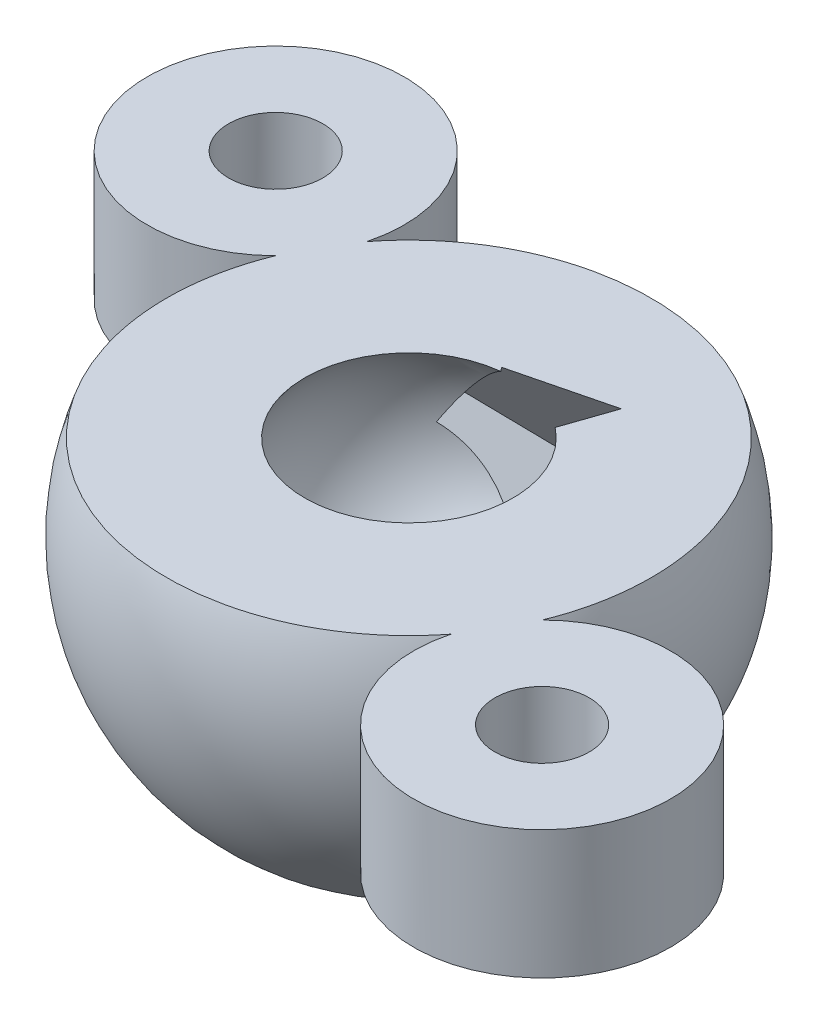
ISO-10303-21;
HEADER;
FILE_DESCRIPTION(('STEP AP214'),'2;1');
FILE_NAME('part.step','',(''),(''),'','','');
FILE_SCHEMA(('AUTOMOTIVE_DESIGN { 1 0 10303 214 1 1 1 1 }'));
ENDSEC;
DATA;
#1=APPLICATION_CONTEXT('core data for automotive mechanical design processes');
#2=APPLICATION_PROTOCOL_DEFINITION('international standard','automotive_design',2000,#1);
#3=PRODUCT_CONTEXT('',#1,'mechanical');
#4=PRODUCT('Part','Part','',(#3));
#5=PRODUCT_RELATED_PRODUCT_CATEGORY('part','',(#4));
#6=PRODUCT_DEFINITION_FORMATION('','',#4);
#7=PRODUCT_DEFINITION_CONTEXT('part definition',#1,'design');
#8=PRODUCT_DEFINITION('design','',#6,#7);
#9=PRODUCT_DEFINITION_SHAPE('','',#8);
#10=(LENGTH_UNIT() NAMED_UNIT(*) SI_UNIT(.MILLI.,.METRE.));
#11=(NAMED_UNIT(*) PLANE_ANGLE_UNIT() SI_UNIT($,.RADIAN.));
#12=(NAMED_UNIT(*) SI_UNIT($,.STERADIAN.) SOLID_ANGLE_UNIT());
#13=UNCERTAINTY_MEASURE_WITH_UNIT(LENGTH_MEASURE(1.E-05),#10,'distance_accuracy_value','');
#14=(GEOMETRIC_REPRESENTATION_CONTEXT(3) GLOBAL_UNCERTAINTY_ASSIGNED_CONTEXT((#13)) GLOBAL_UNIT_ASSIGNED_CONTEXT((#10,
#11,#12)) REPRESENTATION_CONTEXT('',''));
#15=CARTESIAN_POINT('',(0.,0.,0.));
#16=DIRECTION('',(0.,0.,1.));
#17=DIRECTION('',(1.,0.,0.));
#18=AXIS2_PLACEMENT_3D('',#15,#16,#17);
#19=CARTESIAN_POINT('',(-71.2916512459885,-73.,25.9807621135332));
#20=DIRECTION('',(0.866025403784439,0.,0.5));
#21=DIRECTION('',(-0.5,0.,0.866025403784439));
#22=AXIS2_PLACEMENT_3D('',#19,#20,#21);
#23=SPHERICAL_SURFACE('',#22,6.);
#24=CARTESIAN_POINT('',(-71.2916512459885,-71.,25.9807621135332));
#25=DIRECTION('',(0.,1.,0.));
#26=DIRECTION('',(0.,0.,1.));
#27=AXIS2_PLACEMENT_3D('',#24,#25,#26);
#28=CIRCLE('',#27,5.65685424949238);
#29=CARTESIAN_POINT('',(-66.8289289741654,-71.,29.4569827516075));
#30=VERTEX_POINT('',#29);
#31=CARTESIAN_POINT('',(-76.5335077636322,-71.,23.8540415751369));
#32=VERTEX_POINT('',#31);
#33=EDGE_CURVE('E238',#30,#32,#28,.F.);
#34=ORIENTED_EDGE('',*,*,#33,.T.);
#35=CARTESIAN_POINT('',(-76.533379503014,-70.9998000000002,23.8539135435824));
#36=CARTESIAN_POINT('',(-76.5513822523038,-71.0278724460281,23.8718813414579));
#37=CARTESIAN_POINT('',(-76.5689283802293,-71.0567865660781,23.8889444124775));
#38=CARTESIAN_POINT('',(-76.6030689551543,-71.1160434934823,23.9213978423869));
#39=CARTESIAN_POINT('',(-76.6196641554812,-71.1463851342514,23.9367895342484));
#40=CARTESIAN_POINT('',(-76.6678802793491,-71.2389943886753,23.9805871424709));
#41=CARTESIAN_POINT('',(-76.6980747524204,-71.3030725103163,24.0067555568236));
#42=CARTESIAN_POINT('',(-76.7542603476592,-71.4339893832939,24.0538244829102));
#43=CARTESIAN_POINT('',(-76.780290783787,-71.5007937830545,24.0747754522266));
#44=CARTESIAN_POINT('',(-76.8285717581236,-71.6369688871943,24.1125438172381));
#45=CARTESIAN_POINT('',(-76.8508176149279,-71.7063426425283,24.129356104836));
#46=CARTESIAN_POINT('',(-76.8978448150564,-71.8687142272827,24.1640728882728));
#47=CARTESIAN_POINT('',(-76.9212777033325,-71.9623745047607,24.1807031023298));
#48=CARTESIAN_POINT('',(-76.9617981429525,-72.1518627703872,24.2088439251978));
#49=CARTESIAN_POINT('',(-76.9788803899509,-72.2476925000112,24.2203502558872));
#50=CARTESIAN_POINT('',(-77.0068654402581,-72.4413341169988,24.2389410917483));
#51=CARTESIAN_POINT('',(-77.017725523215,-72.5391550423466,24.2459950605386));
#52=CARTESIAN_POINT('',(-77.0331450620405,-72.7354433347076,24.255951949864));
#53=CARTESIAN_POINT('',(-77.037707921676,-72.8339103235681,24.2588571129357));
#54=CARTESIAN_POINT('',(-77.0404545474236,-73.0229211548649,24.2606093709607));
#55=CARTESIAN_POINT('',(-77.0391287029001,-73.1134555342488,24.2597684110798));
#56=CARTESIAN_POINT('',(-77.0311895352861,-73.2941775183519,24.254683933004));
#57=CARTESIAN_POINT('',(-77.0245774648773,-73.3843652001414,24.2504412209245));
#58=CARTESIAN_POINT('',(-77.006141652888,-73.5629332316183,24.238435681694));
#59=CARTESIAN_POINT('',(-76.994378358963,-73.6513224558665,24.2307136534733));
#60=CARTESIAN_POINT('',(-76.9655865972483,-73.8268475917444,24.2113554311455));
#61=CARTESIAN_POINT('',(-76.9485554224484,-73.9139828348421,24.1997172243577));
#62=CARTESIAN_POINT('',(-76.9288621112924,-74.0002,24.1859212793364));
#63=B_SPLINE_CURVE_WITH_KNOTS('',3,(#35,#36,#37,#38,#39,#40,#41,#42,#43,#44,#45,#46,#47,#48,#49,
#50,#51,#52,#53,#54,#55,#56,#57,#58,#59,#60,#61,#62),.UNSPECIFIED.,.F.,.F.,(4,2,2,2,2,2,2,2,2,2,
2,2,2,4),(0.,0.113585797209058,0.227080330731901,0.453169231823026,0.676978393535421,
0.901062418300005,1.19454534747421,1.4882728591717,1.78399360635975,2.0795544482651,
2.35098507155573,2.6223513927487,2.89061526718654,3.15901722427214),.UNSPECIFIED.);
#64=CARTESIAN_POINT('',(-76.9289078099031,-74.,24.1859533681225));
#65=VERTEX_POINT('',#64);
#66=EDGE_CURVE('E200',#32,#65,#63,.T.);
#67=ORIENTED_EDGE('',*,*,#66,.T.);
#68=CARTESIAN_POINT('',(-71.2916512459885,-74.,25.9807621135332));
#69=DIRECTION('',(0.,-1.,0.));
#70=DIRECTION('',(0.,0.,-1.));
#71=AXIS2_PLACEMENT_3D('',#68,#69,#70);
#72=CIRCLE('',#71,5.91607978309961);
#73=CARTESIAN_POINT('',(-75.6646294964059,-74.,21.9961590942379));
#74=VERTEX_POINT('',#73);
#75=EDGE_CURVE('E243',#74,#65,#72,.F.);
#76=ORIENTED_EDGE('',*,*,#75,.F.);
#77=CARTESIAN_POINT('',(-75.6646344368045,-74.0002,21.9962147147887));
#78=CARTESIAN_POINT('',(-75.6633888356013,-73.9496620404665,21.9821616619729));
#79=CARTESIAN_POINT('',(-75.6623415944734,-73.8988041487702,21.9692825032757));
#80=CARTESIAN_POINT('',(-75.6605608125414,-73.7965686087353,21.9458074488093));
#81=CARTESIAN_POINT('',(-75.6598272091041,-73.7451910662703,21.9352110973755));
#82=CARTESIAN_POINT('',(-75.6579724778862,-73.5904873630535,21.906752627044));
#83=CARTESIAN_POINT('',(-75.6571961990867,-73.4865322631475,21.8922052262379));
#84=CARTESIAN_POINT('',(-75.6561492044103,-73.2757451332539,21.8714358365173));
#85=CARTESIAN_POINT('',(-75.6558887501298,-73.1688967733631,21.8653835162145));
#86=CARTESIAN_POINT('',(-75.6557388500508,-72.9550449188531,21.8620057069676));
#87=CARTESIAN_POINT('',(-75.6558494552424,-72.8480414049326,21.8646814174088));
#88=CARTESIAN_POINT('',(-75.6565139309591,-72.6348501805666,21.8788080781848));
#89=CARTESIAN_POINT('',(-75.6570668177186,-72.52866118703,21.8902395507054));
#90=CARTESIAN_POINT('',(-75.658932984532,-72.3176550384306,21.9221122365818));
#91=CARTESIAN_POINT('',(-75.6602461291807,-72.2128376424789,21.942551845395));
#92=CARTESIAN_POINT('',(-75.664215605294,-72.0065978326292,21.99265776047));
#93=CARTESIAN_POINT('',(-75.6668576258116,-71.9051512731432,22.0222244911691));
#94=CARTESIAN_POINT('',(-75.6744096471219,-71.7058549967528,22.0913215311751));
#95=CARTESIAN_POINT('',(-75.6793176448857,-71.6080021854261,22.1308430268951));
#96=CARTESIAN_POINT('',(-75.6926035100455,-71.4206435124871,22.2194232191493));
#97=CARTESIAN_POINT('',(-75.7008652767348,-71.3309707282417,22.2681361305945));
#98=CARTESIAN_POINT('',(-75.7173121911826,-71.2020077467897,22.3498668481378));
#99=CARTESIAN_POINT('',(-75.7235021163503,-71.1597920463395,22.3786824625324));
#100=CARTESIAN_POINT('',(-75.7375920543501,-71.0778030739371,22.4393745053193));
#101=CARTESIAN_POINT('',(-75.7454953975155,-71.0380347549418,22.4712568263021));
#102=CARTESIAN_POINT('',(-75.7544202660792,-70.9997999999986,22.5047165681867));
#103=B_SPLINE_CURVE_WITH_KNOTS('',3,(#77,#78,#79,#80,#81,#82,#83,#84,#85,#86,#87,#88,#89,#90,
#91,#92,#93,#94,#95,#96,#97,#98,#99,#100,#101,#102),.UNSPECIFIED.,.F.,.F.,(4,2,2,2,2,2,2,2,2,2,
2,2,4),(0.,0.157377048485897,0.314722654217878,0.629234458382303,0.949942579700638,
1.270694773823,1.5907354969119,1.91071923689573,2.22732850930363,2.54365844666378,
2.84986255835413,3.00416307873576,3.15876624238512),.UNSPECIFIED.);
#104=CARTESIAN_POINT('',(-75.7543735178116,-71.,22.5045414754588));
#105=VERTEX_POINT('',#104);
#106=EDGE_CURVE('E190',#74,#105,#103,.T.);
#107=ORIENTED_EDGE('',*,*,#106,.T.);
#108=CARTESIAN_POINT('',(-66.0497947283448,-71.,28.1074826519294));
#109=VERTEX_POINT('',#108);
#110=EDGE_CURVE('E240',#105,#109,#28,.F.);
#111=ORIENTED_EDGE('',*,*,#110,.T.);
#112=CARTESIAN_POINT('',(-66.0499229889631,-70.9998000000002,28.107610683484));
#113=CARTESIAN_POINT('',(-66.0319202396732,-71.0278724460281,28.0896428856084));
#114=CARTESIAN_POINT('',(-66.0143741117478,-71.0567865660781,28.0725798145888));
#115=CARTESIAN_POINT('',(-65.9802335368228,-71.1160434934823,28.0401263846795));
#116=CARTESIAN_POINT('',(-65.9636383364959,-71.1463851342514,28.0247346928179));
#117=CARTESIAN_POINT('',(-65.915422212628,-71.2389943886752,27.9809370845955));
#118=CARTESIAN_POINT('',(-65.8852277395567,-71.3030725103162,27.9547686702427));
#119=CARTESIAN_POINT('',(-65.8290421443179,-71.4339893832939,27.9076997441562));
#120=CARTESIAN_POINT('',(-65.8030117081901,-71.5007937830544,27.8867487748397));
#121=CARTESIAN_POINT('',(-65.7547307338535,-71.6369688871942,27.8489804098282));
#122=CARTESIAN_POINT('',(-65.7324848770491,-71.7063426425282,27.8321681222303));
#123=CARTESIAN_POINT('',(-65.6854576769207,-71.8687142272826,27.7974513387935));
#124=CARTESIAN_POINT('',(-65.6620247886445,-71.9623745047607,27.7808211247366));
#125=CARTESIAN_POINT('',(-65.6215043490245,-72.1518627703871,27.7526803018685));
#126=CARTESIAN_POINT('',(-65.6044221020261,-72.2476925000111,27.7411739711792));
#127=CARTESIAN_POINT('',(-65.5764370517189,-72.4413341169987,27.7225831353181));
#128=CARTESIAN_POINT('',(-65.565576968762,-72.5391550423466,27.7155291665277));
#129=CARTESIAN_POINT('',(-65.5501574299365,-72.7354433347076,27.7055722772024));
#130=CARTESIAN_POINT('',(-65.545594570301,-72.833910323568,27.7026671141307));
#131=CARTESIAN_POINT('',(-65.5428479445534,-73.0229211548648,27.7009148561056));
#132=CARTESIAN_POINT('',(-65.544173789077,-73.1134555342487,27.7017558159865));
#133=CARTESIAN_POINT('',(-65.552112956691,-73.2941775183519,27.7068402940624));
#134=CARTESIAN_POINT('',(-65.5587250270998,-73.3843652001413,27.7110830061418));
#135=CARTESIAN_POINT('',(-65.577160839089,-73.5629332316183,27.7230885453723));
#136=CARTESIAN_POINT('',(-65.5889241330141,-73.6513224558665,27.730810573593));
#137=CARTESIAN_POINT('',(-65.6177158947287,-73.8268475917444,27.7501687959208));
#138=CARTESIAN_POINT('',(-65.6347470695286,-73.9139828348421,27.7618070027086));
#139=CARTESIAN_POINT('',(-65.6544403806847,-74.0002,27.7756029477299));
#140=B_SPLINE_CURVE_WITH_KNOTS('',3,(#112,#113,#114,#115,#116,#117,#118,#119,#120,#121,#122,
#123,#124,#125,#126,#127,#128,#129,#130,#131,#132,#133,#134,#135,#136,#137,#138,#139),
.UNSPECIFIED.,.F.,.F.,(4,2,2,2,2,2,2,2,2,2,2,2,2,4),(0.,0.113585797209045,0.227080330731883,
0.453169231822996,0.676978393535378,0.901062418299968,1.19454534747416,1.48827285917165,
1.7839936063597,2.07955444826504,2.35098507155568,2.62235139274866,2.89061526718652,
3.15901722427215),.UNSPECIFIED.);
#141=CARTESIAN_POINT('',(-65.654394682074,-74.,27.7755708589438));
#142=VERTEX_POINT('',#141);
#143=EDGE_CURVE('E233',#109,#142,#140,.T.);
#144=ORIENTED_EDGE('',*,*,#143,.T.);
#145=CARTESIAN_POINT('',(-71.2916512459885,-74.,25.9807621135332));
#146=DIRECTION('',(0.,-1.,0.));
#147=DIRECTION('',(0.,0.,-1.));
#148=AXIS2_PLACEMENT_3D('',#145,#146,#147);
#149=CIRCLE('',#148,5.91607978309961);
#150=CARTESIAN_POINT('',(-66.9186729955712,-74.,29.9653651328284));
#151=VERTEX_POINT('',#150);
#152=EDGE_CURVE('E239',#151,#142,#149,.F.);
#153=ORIENTED_EDGE('',*,*,#152,.F.);
#154=CARTESIAN_POINT('',(-66.9186680551725,-74.0002,29.9653095122776));
#155=CARTESIAN_POINT('',(-66.9199136563757,-73.9496620404665,29.9793625650934));
#156=CARTESIAN_POINT('',(-66.9209608975036,-73.8988041487702,29.9922417237906));
#157=CARTESIAN_POINT('',(-66.9227416794356,-73.7965686087353,30.015716778257));
#158=CARTESIAN_POINT('',(-66.9234752828729,-73.7451910662704,30.0263131296908));
#159=CARTESIAN_POINT('',(-66.9253300140908,-73.5904873630535,30.0547716000223));
#160=CARTESIAN_POINT('',(-66.9261062928903,-73.4865322631475,30.0693190008284));
#161=CARTESIAN_POINT('',(-66.9271532875668,-73.275745133254,30.090088390549));
#162=CARTESIAN_POINT('',(-66.9274137418472,-73.1688967733631,30.0961407108518));
#163=CARTESIAN_POINT('',(-66.9275636419262,-72.9550449188531,30.0995185200987));
#164=CARTESIAN_POINT('',(-66.9274530367347,-72.8480414049326,30.0968428096575));
#165=CARTESIAN_POINT('',(-66.9267885610179,-72.6348501805666,30.0827161488815));
#166=CARTESIAN_POINT('',(-66.9262356742585,-72.5286611870301,30.0712846763609));
#167=CARTESIAN_POINT('',(-66.924369507445,-72.3176550384306,30.0394119904845));
#168=CARTESIAN_POINT('',(-66.9230563627963,-72.212837642479,30.0189723816714));
#169=CARTESIAN_POINT('',(-66.919086886683,-72.0065978326292,29.9688664665963));
#170=CARTESIAN_POINT('',(-66.9164448661654,-71.9051512731432,29.9392997358972));
#171=CARTESIAN_POINT('',(-66.9088928448551,-71.7058549967529,29.8702026958912));
#172=CARTESIAN_POINT('',(-66.9039848470913,-71.6080021854262,29.8306812001712));
#173=CARTESIAN_POINT('',(-66.8906989819315,-71.4206435124872,29.742101007917));
#174=CARTESIAN_POINT('',(-66.8824372152422,-71.3309707282417,29.6933880964718));
#175=CARTESIAN_POINT('',(-66.8659903007945,-71.2020077467898,29.6116573789285));
#176=CARTESIAN_POINT('',(-66.8598003756267,-71.1597920463395,29.5828417645339));
#177=CARTESIAN_POINT('',(-66.8457104376269,-71.0778030739371,29.522149721747));
#178=CARTESIAN_POINT('',(-66.8378070944615,-71.0380347549417,29.4902674007642));
#179=CARTESIAN_POINT('',(-66.8288822258978,-70.9997999999986,29.4568076588796));
#180=B_SPLINE_CURVE_WITH_KNOTS('',3,(#154,#155,#156,#157,#158,#159,#160,#161,#162,#163,#164,
#165,#166,#167,#168,#169,#170,#171,#172,#173,#174,#175,#176,#177,#178,#179),.UNSPECIFIED.,.F.,
.F.,(4,2,2,2,2,2,2,2,2,2,2,2,4),(0.,0.157377048485883,0.31472265421785,0.62923445838229,
0.949942579700624,1.27069477382297,1.59073549691185,1.91071923689568,2.22732850930357,
2.54365844666373,2.8498625583541,3.00416307873576,3.15876624238512),.UNSPECIFIED.);
#181=EDGE_CURVE('E224',#151,#30,#180,.T.);
#182=ORIENTED_EDGE('',*,*,#181,.T.);
#183=EDGE_LOOP('',(#34,#67,#76,#107,#111,#144,#153,#182));
#184=FACE_BOUND('',#183,.T.);
#185=CARTESIAN_POINT('',(-69.9233645908581,-71.7684504931306,26.4509508432172));
#186=DIRECTION('',(-0.720150871121256,-0.648183950983876,-0.247467752465304));
#187=DIRECTION('',(0.668992197049258,-0.743269426444547,0.));
#188=AXIS2_PLACEMENT_3D('',#185,#186,#187);
#189=CIRCLE('',#188,5.69122131005288);
#190=CARTESIAN_POINT('',(-66.1498224819875,-76.0254293010476,26.6198039791837));
#191=VERTEX_POINT('',#190);
#192=CARTESIAN_POINT('',(-67.4543686143179,-72.5784404179814,21.3875552247149));
#193=VERTEX_POINT('',#192);
#194=EDGE_CURVE('E131',#191,#193,#189,.F.);
#195=ORIENTED_EDGE('',*,*,#194,.T.);
#196=CARTESIAN_POINT('',(-71.9439243121537,-71.2765055584669,23.3646377362988));
#197=DIRECTION('',(0.203835333176626,-0.538592012979101,0.817538867885738));
#198=DIRECTION('',(0.,-0.835071027621468,-0.550142144202046));
#199=AXIS2_PLACEMENT_3D('',#196,#197,#198);
#200=CIRCLE('',#199,5.07543101617981);
#201=CARTESIAN_POINT('',(-70.1909419245787,-75.0415394317201,20.4471777653468));
#202=VERTEX_POINT('',#201);
#203=EDGE_CURVE('E165',#193,#202,#200,.F.);
#204=ORIENTED_EDGE('',*,*,#203,.T.);
#205=CARTESIAN_POINT('',(-72.6599379011189,-74.2315495068694,25.5105733838491));
#206=DIRECTION('',(0.720150871121255,0.648183950983876,0.247467752465304));
#207=DIRECTION('',(-0.668992197049259,0.743269426444547,0.));
#208=AXIS2_PLACEMENT_3D('',#205,#206,#207);
#209=CIRCLE('',#208,5.69122131005287);
#210=CARTESIAN_POINT('',(-68.8863957922483,-78.4885283147864,25.6794265198155));
#211=VERTEX_POINT('',#210);
#212=EDGE_CURVE('E160',#202,#211,#209,.F.);
#213=ORIENTED_EDGE('',*,*,#212,.T.);
#214=CARTESIAN_POINT('',(-70.6393781798233,-74.7234944415331,28.5968864907675));
#215=DIRECTION('',(-0.203835333176629,0.538592012979099,-0.817538867885738));
#216=DIRECTION('',(0.,0.835071027621469,0.550142144202044));
#217=AXIS2_PLACEMENT_3D('',#214,#215,#216);
#218=CIRCLE('',#217,5.07543101617979);
#219=EDGE_CURVE('E11',#211,#191,#218,.F.);
#220=ORIENTED_EDGE('',*,*,#219,.T.);
#221=EDGE_LOOP('',(#195,#204,#213,#220));
#222=FACE_BOUND('',#221,.T.);
#223=ADVANCED_FACE('F41',(#184,#222),#23,.T.);
#224=CARTESIAN_POINT('',(-73.8538290724796,-71.,16.4185842870421));
#225=DIRECTION('',(0.,1.,0.));
#226=DIRECTION('',(0.,0.,1.));
#227=AXIS2_PLACEMENT_3D('',#224,#225,#226);
#228=PLANE('',#227);
#229=CARTESIAN_POINT('',(-78.6528671781562,-71.,21.7307621135332));
#230=DIRECTION('',(0.,1.,0.));
#231=DIRECTION('',(0.,0.,1.));
#232=AXIS2_PLACEMENT_3D('',#229,#230,#231);
#233=CIRCLE('',#232,1.1);
#234=CARTESIAN_POINT('',(-78.6528671781562,-71.,22.8307621135332));
#235=VERTEX_POINT('',#234);
#236=EDGE_CURVE('E171',#235,#235,#233,.F.);
#237=ORIENTED_EDGE('',*,*,#236,.T.);
#238=EDGE_LOOP('',(#237));
#239=FACE_BOUND('',#238,.T.);
#240=CARTESIAN_POINT('',(-63.9304353138208,-71.,30.2307621135332));
#241=DIRECTION('',(0.,1.,0.));
#242=DIRECTION('',(0.,0.,1.));
#243=AXIS2_PLACEMENT_3D('',#240,#241,#242);
#244=CIRCLE('',#243,1.1);
#245=CARTESIAN_POINT('',(-63.9304353138208,-71.,31.3307621135332));
#246=VERTEX_POINT('',#245);
#247=EDGE_CURVE('E177',#246,#246,#244,.F.);
#248=ORIENTED_EDGE('',*,*,#247,.T.);
#249=EDGE_LOOP('',(#248));
#250=FACE_BOUND('',#249,.T.);
#251=ORIENTED_EDGE('',*,*,#110,.F.);
#252=CARTESIAN_POINT('',(-78.6528671781562,-71.,21.7307621135332));
#253=DIRECTION('',(0.,-1.,0.));
#254=DIRECTION('',(0.,0.,-1.));
#255=AXIS2_PLACEMENT_3D('',#252,#253,#254);
#256=CIRCLE('',#255,3.);
#257=EDGE_CURVE('E189',#32,#105,#256,.T.);
#258=ORIENTED_EDGE('',*,*,#257,.F.);
#259=ORIENTED_EDGE('',*,*,#33,.F.);
#260=CARTESIAN_POINT('',(-63.9304353138208,-71.,30.2307621135332));
#261=DIRECTION('',(0.,-1.,0.));
#262=DIRECTION('',(0.,0.,-1.));
#263=AXIS2_PLACEMENT_3D('',#260,#261,#262);
#264=CIRCLE('',#263,3.);
#265=EDGE_CURVE('E292',#109,#30,#264,.T.);
#266=ORIENTED_EDGE('',*,*,#265,.F.);
#267=EDGE_LOOP('',(#251,#258,#259,#266));
#268=FACE_BOUND('',#267,.T.);
#269=DIRECTION('',(0.970295726275996,0.,-0.241921895599668));
#270=VECTOR('',#269,1.);
#271=CARTESIAN_POINT('',(-72.0688026125478,-71.,23.5779343783935));
#272=LINE('',#271,#270);
#273=CARTESIAN_POINT('',(-71.6367187442011,-71.,23.4702037704379));
#274=VERTEX_POINT('',#273);
#275=CARTESIAN_POINT('',(-69.3990173667522,-71.,22.9122821550391));
#276=VERTEX_POINT('',#275);
#277=EDGE_CURVE('E47',#274,#276,#272,.T.);
#278=ORIENTED_EDGE('',*,*,#277,.T.);
#279=DIRECTION('',(-0.324980984520902,0.,0.945720550532675));
#280=VECTOR('',#279,1.);
#281=CARTESIAN_POINT('',(-67.8737209264594,-71.,18.4735480199762));
#282=LINE('',#281,#280);
#283=CARTESIAN_POINT('',(-69.794226548259,-71.,24.0623723526583));
#284=VERTEX_POINT('',#283);
#285=EDGE_CURVE('E157',#276,#284,#282,.T.);
#286=ORIENTED_EDGE('',*,*,#285,.T.);
#287=CARTESIAN_POINT('',(-71.2916512459885,-71.,25.9807621135332));
#288=DIRECTION('',(0.,1.,0.));
#289=DIRECTION('',(0.,0.,1.));
#290=AXIS2_PLACEMENT_3D('',#287,#288,#289);
#291=CIRCLE('',#290,2.4336187047276);
#292=CARTESIAN_POINT('',(-71.5643738852894,-71.,23.5624729740768));
#293=VERTEX_POINT('',#292);
#294=EDGE_CURVE('E185',#293,#284,#291,.T.);
#295=ORIENTED_EDGE('',*,*,#294,.F.);
#296=DIRECTION('',(-0.617017715423195,0.,-0.786949260660395));
#297=VECTOR('',#296,1.);
#298=CARTESIAN_POINT('',(-75.9047926120562,-71.,18.0266686971397));
#299=LINE('',#298,#297);
#300=EDGE_CURVE('E152',#293,#274,#299,.T.);
#301=ORIENTED_EDGE('',*,*,#300,.T.);
#302=EDGE_LOOP('',(#278,#286,#295,#301));
#303=FACE_BOUND('',#302,.T.);
#304=ADVANCED_FACE('F223',(#239,#250,#268,#303),#228,.T.);
#305=CARTESIAN_POINT('',(-71.2916512459885,-73.,25.9807621135332));
#306=DIRECTION('',(0.866025403784439,0.,0.5));
#307=DIRECTION('',(0.5,0.,-0.866025403784439));
#308=AXIS2_PLACEMENT_3D('',#305,#306,#307);
#309=SPHERICAL_SURFACE('',#308,3.15);
#310=CARTESIAN_POINT('',(-71.2916512459885,-73.,25.9807621135332));
#311=DIRECTION('',(0.663199728416766,-0.538308656109162,-0.51999029893439));
#312=DIRECTION('',(0.630210954645348,0.776423951617285,0.));
#313=AXIS2_PLACEMENT_3D('',#310,#311,#312);
#314=CIRCLE('',#313,3.15);
#315=CARTESIAN_POINT('',(-73.1720678375226,-72.8783538216271,23.4565323994282));
#316=VERTEX_POINT('',#315);
#317=EDGE_CURVE('E260',#293,#316,#314,.F.);
#318=ORIENTED_EDGE('',*,*,#317,.F.);
#319=ORIENTED_EDGE('',*,*,#294,.T.);
#320=CARTESIAN_POINT('',(-69.9233645908581,-71.7684504931306,26.4509508432172));
#321=DIRECTION('',(-0.720150871121256,-0.648183950983876,-0.247467752465304));
#322=DIRECTION('',(0.668992197049258,-0.743269426444547,0.));
#323=AXIS2_PLACEMENT_3D('',#320,#321,#322);
#324=CIRCLE('',#323,2.51246890528022);
#325=CARTESIAN_POINT('',(-69.4112346544544,-73.1216461783729,28.5049918276382));
#326=VERTEX_POINT('',#325);
#327=EDGE_CURVE('E257',#326,#284,#324,.F.);
#328=ORIENTED_EDGE('',*,*,#327,.F.);
#329=CARTESIAN_POINT('',(-72.1478079647152,-75.5847451921116,27.56461436827));
#330=VERTEX_POINT('',#329);
#331=EDGE_CURVE('E139',#330,#326,#314,.F.);
#332=ORIENTED_EDGE('',*,*,#331,.F.);
#333=CARTESIAN_POINT('',(-72.6599379011189,-74.2315495068694,25.5105733838491));
#334=DIRECTION('',(0.720150871121255,0.648183950983876,0.247467752465304));
#335=DIRECTION('',(-0.668992197049259,0.743269426444547,0.));
#336=AXIS2_PLACEMENT_3D('',#333,#334,#335);
#337=CIRCLE('',#336,2.51246890528021);
#338=EDGE_CURVE('E256',#316,#330,#337,.F.);
#339=ORIENTED_EDGE('',*,*,#338,.F.);
#340=EDGE_LOOP('',(#318,#319,#328,#332,#339));
#341=FACE_BOUND('',#340,.T.);
#342=ADVANCED_FACE('F274',(#341),#309,.F.);
#343=CARTESIAN_POINT('',(-78.6528671781562,-74.25,21.7307621135332));
#344=DIRECTION('',(0.,1.,0.));
#345=DIRECTION('',(0.,0.,1.));
#346=AXIS2_PLACEMENT_3D('',#343,#344,#345);
#347=CYLINDRICAL_SURFACE('',#346,1.1);
#348=ORIENTED_EDGE('',*,*,#236,.F.);
#349=EDGE_LOOP('',(#348));
#350=FACE_BOUND('',#349,.T.);
#351=CARTESIAN_POINT('',(-78.6528671781562,-72.8,21.7307621135332));
#352=DIRECTION('',(0.,-1.,0.));
#353=DIRECTION('',(0.,0.,-1.));
#354=AXIS2_PLACEMENT_3D('',#351,#352,#353);
#355=CIRCLE('',#354,1.1);
#356=CARTESIAN_POINT('',(-78.6528671781562,-72.8,20.6307621135332));
#357=VERTEX_POINT('',#356);
#358=EDGE_CURVE('E167',#357,#357,#355,.T.);
#359=ORIENTED_EDGE('',*,*,#358,.T.);
#360=EDGE_LOOP('',(#359));
#361=FACE_BOUND('',#360,.T.);
#362=ADVANCED_FACE('F281',(#350,#361),#347,.F.);
#363=CARTESIAN_POINT('',(-63.9304353138208,-74.25,30.2307621135332));
#364=DIRECTION('',(0.,1.,0.));
#365=DIRECTION('',(0.,0.,1.));
#366=AXIS2_PLACEMENT_3D('',#363,#364,#365);
#367=CYLINDRICAL_SURFACE('',#366,1.1);
#368=ORIENTED_EDGE('',*,*,#247,.F.);
#369=EDGE_LOOP('',(#368));
#370=FACE_BOUND('',#369,.T.);
#371=CARTESIAN_POINT('',(-63.9304353138208,-72.8,30.2307621135332));
#372=DIRECTION('',(0.,-1.,0.));
#373=DIRECTION('',(0.,0.,-1.));
#374=AXIS2_PLACEMENT_3D('',#371,#372,#373);
#375=CIRCLE('',#374,1.1);
#376=CARTESIAN_POINT('',(-63.9304353138208,-72.8,29.1307621135332));
#377=VERTEX_POINT('',#376);
#378=EDGE_CURVE('E178',#377,#377,#375,.T.);
#379=ORIENTED_EDGE('',*,*,#378,.T.);
#380=EDGE_LOOP('',(#379));
#381=FACE_BOUND('',#380,.T.);
#382=ADVANCED_FACE('F217',(#370,#381),#367,.F.);
#383=CARTESIAN_POINT('',(-63.9304353138208,-74.,30.2307621135332));
#384=DIRECTION('',(0.,1.,0.));
#385=DIRECTION('',(0.,0.,1.));
#386=AXIS2_PLACEMENT_3D('',#383,#384,#385);
#387=CYLINDRICAL_SURFACE('',#386,3.);
#388=ORIENTED_EDGE('',*,*,#143,.F.);
#389=ORIENTED_EDGE('',*,*,#265,.T.);
#390=ORIENTED_EDGE('',*,*,#181,.F.);
#391=CARTESIAN_POINT('',(-63.9304353138208,-74.,30.2307621135332));
#392=DIRECTION('',(0.,-1.,0.));
#393=DIRECTION('',(0.,0.,-1.));
#394=AXIS2_PLACEMENT_3D('',#391,#392,#393);
#395=CIRCLE('',#394,3.);
#396=EDGE_CURVE('E300',#142,#151,#395,.T.);
#397=ORIENTED_EDGE('',*,*,#396,.F.);
#398=EDGE_LOOP('',(#388,#389,#390,#397));
#399=FACE_BOUND('',#398,.T.);
#400=ADVANCED_FACE('F212',(#399),#387,.T.);
#401=CARTESIAN_POINT('',(-63.9304353138208,-74.,30.2307621135332));
#402=DIRECTION('',(0.,-1.,0.));
#403=DIRECTION('',(0.,0.,-1.));
#404=AXIS2_PLACEMENT_3D('',#401,#402,#403);
#405=PLANE('',#404);
#406=CARTESIAN_POINT('',(-63.9304353138208,-74.,30.2307621135332));
#407=DIRECTION('',(0.,-1.,0.));
#408=DIRECTION('',(0.,0.,-1.));
#409=AXIS2_PLACEMENT_3D('',#406,#407,#408);
#410=CIRCLE('',#409,2.1);
#411=CARTESIAN_POINT('',(-63.9304353138208,-74.,28.1307621135332));
#412=VERTEX_POINT('',#411);
#413=EDGE_CURVE('E182',#412,#412,#410,.F.);
#414=ORIENTED_EDGE('',*,*,#413,.T.);
#415=EDGE_LOOP('',(#414));
#416=FACE_BOUND('',#415,.T.);
#417=ORIENTED_EDGE('',*,*,#396,.T.);
#418=ORIENTED_EDGE('',*,*,#152,.T.);
#419=EDGE_LOOP('',(#417,#418));
#420=FACE_BOUND('',#419,.T.);
#421=ADVANCED_FACE('F209',(#416,#420),#405,.T.);
#422=CARTESIAN_POINT('',(-78.6528671781562,-74.,21.7307621135332));
#423=DIRECTION('',(0.,1.,0.));
#424=DIRECTION('',(0.,0.,1.));
#425=AXIS2_PLACEMENT_3D('',#422,#423,#424);
#426=CYLINDRICAL_SURFACE('',#425,3.);
#427=ORIENTED_EDGE('',*,*,#66,.F.);
#428=ORIENTED_EDGE('',*,*,#257,.T.);
#429=ORIENTED_EDGE('',*,*,#106,.F.);
#430=CARTESIAN_POINT('',(-78.6528671781562,-74.,21.7307621135332));
#431=DIRECTION('',(0.,-1.,0.));
#432=DIRECTION('',(0.,0.,-1.));
#433=AXIS2_PLACEMENT_3D('',#430,#431,#432);
#434=CIRCLE('',#433,3.);
#435=EDGE_CURVE('E183',#65,#74,#434,.T.);
#436=ORIENTED_EDGE('',*,*,#435,.F.);
#437=EDGE_LOOP('',(#427,#428,#429,#436));
#438=FACE_BOUND('',#437,.T.);
#439=ADVANCED_FACE('F201',(#438),#426,.T.);
#440=CARTESIAN_POINT('',(-78.6528671781562,-74.,21.7307621135332));
#441=DIRECTION('',(0.,-1.,0.));
#442=DIRECTION('',(0.,0.,-1.));
#443=AXIS2_PLACEMENT_3D('',#440,#441,#442);
#444=PLANE('',#443);
#445=CARTESIAN_POINT('',(-78.6528671781562,-74.,21.7307621135332));
#446=DIRECTION('',(0.,-1.,0.));
#447=DIRECTION('',(0.,0.,-1.));
#448=AXIS2_PLACEMENT_3D('',#445,#446,#447);
#449=CIRCLE('',#448,2.1);
#450=CARTESIAN_POINT('',(-78.6528671781562,-74.,19.6307621135332));
#451=VERTEX_POINT('',#450);
#452=EDGE_CURVE('E174',#451,#451,#449,.F.);
#453=ORIENTED_EDGE('',*,*,#452,.T.);
#454=EDGE_LOOP('',(#453));
#455=FACE_BOUND('',#454,.T.);
#456=ORIENTED_EDGE('',*,*,#435,.T.);
#457=ORIENTED_EDGE('',*,*,#75,.T.);
#458=EDGE_LOOP('',(#456,#457));
#459=FACE_BOUND('',#458,.T.);
#460=ADVANCED_FACE('F206',(#455,#459),#444,.T.);
#461=CARTESIAN_POINT('',(-63.9304353138208,-74.25,30.2307621135332));
#462=DIRECTION('',(0.,1.,0.));
#463=DIRECTION('',(0.,0.,1.));
#464=AXIS2_PLACEMENT_3D('',#461,#462,#463);
#465=CYLINDRICAL_SURFACE('',#464,2.1);
#466=ORIENTED_EDGE('',*,*,#413,.F.);
#467=EDGE_LOOP('',(#466));
#468=FACE_BOUND('',#467,.T.);
#469=CARTESIAN_POINT('',(-63.9304353138208,-72.8,30.2307621135332));
#470=DIRECTION('',(0.,-1.,0.));
#471=DIRECTION('',(0.,0.,-1.));
#472=AXIS2_PLACEMENT_3D('',#469,#470,#471);
#473=CIRCLE('',#472,2.1);
#474=CARTESIAN_POINT('',(-63.9304353138208,-72.8,28.1307621135332));
#475=VERTEX_POINT('',#474);
#476=EDGE_CURVE('E172',#475,#475,#473,.T.);
#477=ORIENTED_EDGE('',*,*,#476,.F.);
#478=EDGE_LOOP('',(#477));
#479=FACE_BOUND('',#478,.T.);
#480=ADVANCED_FACE('F327',(#468,#479),#465,.F.);
#481=CARTESIAN_POINT('',(-63.9304353138208,-72.8,30.2307621135332));
#482=DIRECTION('',(0.,-1.,0.));
#483=DIRECTION('',(0.,0.,-1.));
#484=AXIS2_PLACEMENT_3D('',#481,#482,#483);
#485=PLANE('',#484);
#486=ORIENTED_EDGE('',*,*,#378,.F.);
#487=EDGE_LOOP('',(#486));
#488=FACE_BOUND('',#487,.T.);
#489=ORIENTED_EDGE('',*,*,#476,.T.);
#490=EDGE_LOOP('',(#489));
#491=FACE_BOUND('',#490,.T.);
#492=ADVANCED_FACE('F321',(#488,#491),#485,.T.);
#493=CARTESIAN_POINT('',(-78.6528671781562,-74.25,21.7307621135332));
#494=DIRECTION('',(0.,1.,0.));
#495=DIRECTION('',(0.,0.,1.));
#496=AXIS2_PLACEMENT_3D('',#493,#494,#495);
#497=CYLINDRICAL_SURFACE('',#496,2.1);
#498=ORIENTED_EDGE('',*,*,#452,.F.);
#499=EDGE_LOOP('',(#498));
#500=FACE_BOUND('',#499,.T.);
#501=CARTESIAN_POINT('',(-78.6528671781562,-72.8,21.7307621135332));
#502=DIRECTION('',(0.,-1.,0.));
#503=DIRECTION('',(0.,0.,-1.));
#504=AXIS2_PLACEMENT_3D('',#501,#502,#503);
#505=CIRCLE('',#504,2.1);
#506=CARTESIAN_POINT('',(-78.6528671781562,-72.8,19.6307621135332));
#507=VERTEX_POINT('',#506);
#508=EDGE_CURVE('E170',#507,#507,#505,.T.);
#509=ORIENTED_EDGE('',*,*,#508,.F.);
#510=EDGE_LOOP('',(#509));
#511=FACE_BOUND('',#510,.T.);
#512=ADVANCED_FACE('F319',(#500,#511),#497,.F.);
#513=CARTESIAN_POINT('',(-78.6528671781562,-72.8,21.7307621135332));
#514=DIRECTION('',(0.,-1.,0.));
#515=DIRECTION('',(0.,0.,-1.));
#516=AXIS2_PLACEMENT_3D('',#513,#514,#515);
#517=PLANE('',#516);
#518=ORIENTED_EDGE('',*,*,#358,.F.);
#519=EDGE_LOOP('',(#518));
#520=FACE_BOUND('',#519,.T.);
#521=ORIENTED_EDGE('',*,*,#508,.T.);
#522=EDGE_LOOP('',(#521));
#523=FACE_BOUND('',#522,.T.);
#524=ADVANCED_FACE('F314',(#520,#523),#517,.T.);
#525=CARTESIAN_POINT('',(-65.3756675507861,-81.3381305094941,22.9267947717396));
#526=DIRECTION('',(0.720150871121255,0.648183950983876,0.247467752465304));
#527=DIRECTION('',(-0.668992197049259,0.743269426444547,0.));
#528=AXIS2_PLACEMENT_3D('',#525,#526,#527);
#529=PLANE('',#528);
#530=DIRECTION('',(-0.663199728416764,0.538308656109163,0.519990298934391));
#531=VECTOR('',#530,1.);
#532=CARTESIAN_POINT('',(-66.6802136831165,-77.8911416264279,17.6945460172708));
#533=LINE('',#532,#531);
#534=CARTESIAN_POINT('',(-73.3122109672841,-72.5080550653363,22.8944490066147));
#535=VERTEX_POINT('',#534);
#536=EDGE_CURVE('E148',#202,#535,#533,.T.);
#537=ORIENTED_EDGE('',*,*,#536,.T.);
#538=DIRECTION('',(-0.203835333176627,0.538592012979099,-0.817538867885739));
#539=VECTOR('',#538,1.);
#540=CARTESIAN_POINT('',(-72.0076648349537,-75.9550439484025,28.1266977610835));
#541=LINE('',#540,#539);
#542=EDGE_CURVE('E141',#316,#535,#541,.T.);
#543=ORIENTED_EDGE('',*,*,#542,.F.);
#544=ORIENTED_EDGE('',*,*,#338,.T.);
#545=CARTESIAN_POINT('',(-72.0076648349537,-75.9550439484025,28.1266977610835));
#546=VERTEX_POINT('',#545);
#547=EDGE_CURVE('E65',#546,#330,#541,.T.);
#548=ORIENTED_EDGE('',*,*,#547,.F.);
#549=DIRECTION('',(-0.663199728416764,0.538308656109163,0.519990298934391));
#550=VECTOR('',#549,1.);
#551=CARTESIAN_POINT('',(-65.3756675507861,-81.3381305094941,22.9267947717396));
#552=LINE('',#551,#550);
#553=EDGE_CURVE('E57',#211,#546,#552,.T.);
#554=ORIENTED_EDGE('',*,*,#553,.F.);
#555=ORIENTED_EDGE('',*,*,#212,.F.);
#556=EDGE_LOOP('',(#537,#543,#544,#548,#554,#555));
#557=FACE_BOUND('',#556,.T.);
#558=ADVANCED_FACE('F275',(#557),#529,.T.);
#559=CARTESIAN_POINT('',(-14.2546930046119,11.5703072630621,11.1765758625705));
#560=DIRECTION('',(0.663199728416766,-0.538308656109162,-0.51999029893439));
#561=DIRECTION('',(0.630210954645348,0.776423951617285,0.));
#562=AXIS2_PLACEMENT_3D('',#559,#560,#561);
#563=PLANE('',#562);
#564=ORIENTED_EDGE('',*,*,#331,.T.);
#565=DIRECTION('',(0.203835333176627,-0.5385920129791,0.817538867885738));
#566=VECTOR('',#565,1.);
#567=CARTESIAN_POINT('',(-70.5756376570233,-70.0449560515975,23.8348264659829));
#568=LINE('',#567,#566);
#569=CARTESIAN_POINT('',(-69.2710915246929,-73.4919449346637,29.0670752204516));
#570=VERTEX_POINT('',#569);
#571=EDGE_CURVE('E126',#326,#570,#568,.T.);
#572=ORIENTED_EDGE('',*,*,#571,.T.);
#573=DIRECTION('',(-0.720150871121255,-0.648183950983877,-0.247467752465303));
#574=VECTOR('',#573,1.);
#575=CARTESIAN_POINT('',(-69.2710915246929,-73.4919449346637,29.0670752204516));
#576=LINE('',#575,#574);
#577=EDGE_CURVE('E140',#570,#546,#576,.T.);
#578=ORIENTED_EDGE('',*,*,#577,.T.);
#579=ORIENTED_EDGE('',*,*,#547,.T.);
#580=EDGE_LOOP('',(#564,#572,#578,#579));
#581=FACE_BOUND('',#580,.T.);
#582=ADVANCED_FACE('F138',(#581),#563,.T.);
#583=CARTESIAN_POINT('',(-66.6802136831165,-77.8911416264279,17.6945460172708));
#584=DIRECTION('',(0.203835333176626,-0.538592012979101,0.817538867885738));
#585=DIRECTION('',(0.,-0.835071027621468,-0.550142144202046));
#586=AXIS2_PLACEMENT_3D('',#583,#584,#585);
#587=PLANE('',#586);
#588=DIRECTION('',(-0.663199728416764,0.538308656109163,0.519990298934391));
#589=VECTOR('',#588,1.);
#590=CARTESIAN_POINT('',(-63.9436403728557,-75.4280426126891,18.634923476639));
#591=LINE('',#590,#589);
#592=EDGE_CURVE('E132',#193,#276,#591,.T.);
#593=ORIENTED_EDGE('',*,*,#592,.T.);
#594=ORIENTED_EDGE('',*,*,#277,.F.);
#595=DIRECTION('',(0.720150871121255,0.648183950983876,0.247467752465306));
#596=VECTOR('',#595,1.);
#597=CARTESIAN_POINT('',(-73.3122109672841,-72.5080550653363,22.8944490066147));
#598=LINE('',#597,#596);
#599=EDGE_CURVE('E137',#535,#274,#598,.T.);
#600=ORIENTED_EDGE('',*,*,#599,.F.);
#601=ORIENTED_EDGE('',*,*,#536,.F.);
#602=ORIENTED_EDGE('',*,*,#203,.F.);
#603=EDGE_LOOP('',(#593,#594,#600,#601,#602));
#604=FACE_BOUND('',#603,.T.);
#605=ADVANCED_FACE('F302',(#604),#587,.T.);
#606=CARTESIAN_POINT('',(-63.9436403728557,-75.4280426126891,18.634923476639));
#607=DIRECTION('',(-0.720150871121256,-0.648183950983876,-0.247467752465304));
#608=DIRECTION('',(0.668992197049258,-0.743269426444547,0.));
#609=AXIS2_PLACEMENT_3D('',#606,#607,#608);
#610=PLANE('',#609);
#611=DIRECTION('',(-0.663199728416764,0.538308656109163,0.519990298934391));
#612=VECTOR('',#611,1.);
#613=CARTESIAN_POINT('',(-62.6390942405253,-78.8750314957554,23.8671722311077));
#614=LINE('',#613,#612);
#615=EDGE_CURVE('E121',#191,#570,#614,.T.);
#616=ORIENTED_EDGE('',*,*,#615,.T.);
#617=ORIENTED_EDGE('',*,*,#571,.F.);
#618=ORIENTED_EDGE('',*,*,#327,.T.);
#619=ORIENTED_EDGE('',*,*,#285,.F.);
#620=ORIENTED_EDGE('',*,*,#592,.F.);
#621=ORIENTED_EDGE('',*,*,#194,.F.);
#622=EDGE_LOOP('',(#616,#617,#618,#619,#620,#621));
#623=FACE_BOUND('',#622,.T.);
#624=ADVANCED_FACE('F129',(#623),#610,.T.);
#625=CARTESIAN_POINT('',(-62.6390942405253,-78.8750314957554,23.8671722311077));
#626=DIRECTION('',(-0.203835333176629,0.538592012979099,-0.817538867885738));
#627=DIRECTION('',(0.,0.835071027621469,0.550142144202044));
#628=AXIS2_PLACEMENT_3D('',#625,#626,#627);
#629=PLANE('',#628);
#630=ORIENTED_EDGE('',*,*,#553,.T.);
#631=ORIENTED_EDGE('',*,*,#577,.F.);
#632=ORIENTED_EDGE('',*,*,#615,.F.);
#633=ORIENTED_EDGE('',*,*,#219,.F.);
#634=EDGE_LOOP('',(#630,#631,#632,#633));
#635=FACE_BOUND('',#634,.T.);
#636=ADVANCED_FACE('F145',(#635),#629,.T.);
#637=ORIENTED_EDGE('',*,*,#317,.T.);
#638=ORIENTED_EDGE('',*,*,#542,.T.);
#639=ORIENTED_EDGE('',*,*,#599,.T.);
#640=ORIENTED_EDGE('',*,*,#300,.F.);
#641=EDGE_LOOP('',(#637,#638,#639,#640));
#642=FACE_BOUND('',#641,.T.);
#643=ADVANCED_FACE('F268',(#642),#563,.T.);
#644=CLOSED_SHELL('',(#223,#304,#342,#362,#382,#400,#421,#439,#460,#480,#492,#512,#524,#558,
#582,#605,#624,#636,#643));
#645=MANIFOLD_SOLID_BREP('B2',#644);
#646=ADVANCED_BREP_SHAPE_REPRESENTATION('',(#18,#645),#14);
#647=SHAPE_DEFINITION_REPRESENTATION(#9,#646);
ENDSEC;
END-ISO-10303-21;
